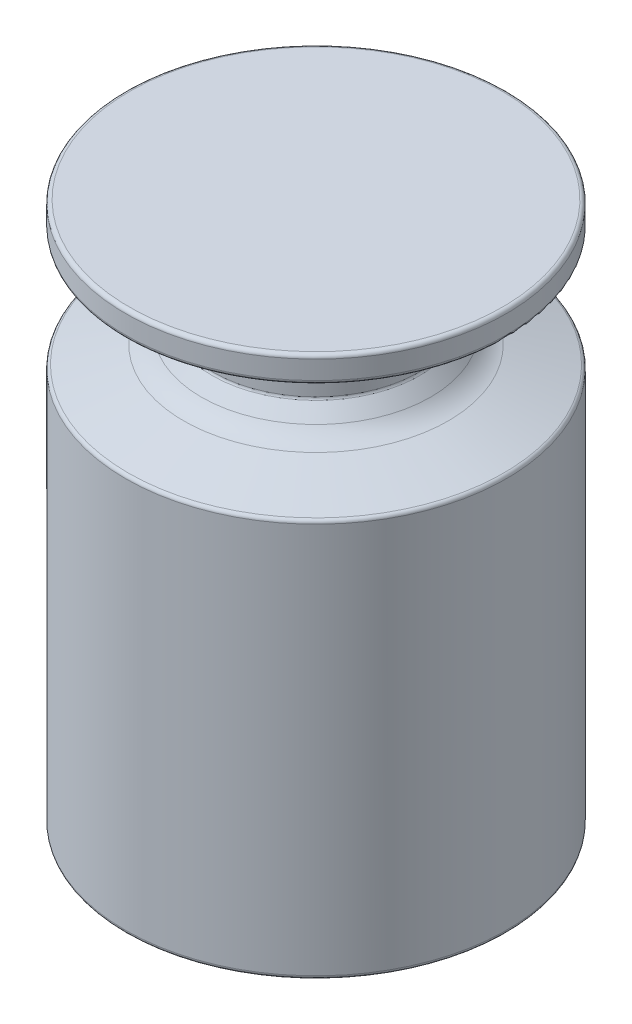
ISO-10303-21;
HEADER;
FILE_DESCRIPTION(('STEP AP214'),'2;1');
FILE_NAME('part.step','',(''),(''),'','','');
FILE_SCHEMA(('AUTOMOTIVE_DESIGN { 1 0 10303 214 1 1 1 1 }'));
ENDSEC;
DATA;
#1=APPLICATION_CONTEXT('core data for automotive mechanical design processes');
#2=APPLICATION_PROTOCOL_DEFINITION('international standard','automotive_design',2000,#1);
#3=PRODUCT_CONTEXT('',#1,'mechanical');
#4=PRODUCT('Part','Part','',(#3));
#5=PRODUCT_RELATED_PRODUCT_CATEGORY('part','',(#4));
#6=PRODUCT_DEFINITION_FORMATION('','',#4);
#7=PRODUCT_DEFINITION_CONTEXT('part definition',#1,'design');
#8=PRODUCT_DEFINITION('design','',#6,#7);
#9=PRODUCT_DEFINITION_SHAPE('','',#8);
#10=(LENGTH_UNIT() NAMED_UNIT(*) SI_UNIT(.MILLI.,.METRE.));
#11=(NAMED_UNIT(*) PLANE_ANGLE_UNIT() SI_UNIT($,.RADIAN.));
#12=(NAMED_UNIT(*) SI_UNIT($,.STERADIAN.) SOLID_ANGLE_UNIT());
#13=UNCERTAINTY_MEASURE_WITH_UNIT(LENGTH_MEASURE(1.E-05),#10,'distance_accuracy_value','');
#14=(GEOMETRIC_REPRESENTATION_CONTEXT(3) GLOBAL_UNCERTAINTY_ASSIGNED_CONTEXT((#13)) GLOBAL_UNIT_ASSIGNED_CONTEXT((#10,
#11,#12)) REPRESENTATION_CONTEXT('',''));
#15=CARTESIAN_POINT('',(0.,0.,0.));
#16=DIRECTION('',(0.,0.,1.));
#17=DIRECTION('',(1.,0.,0.));
#18=AXIS2_PLACEMENT_3D('',#15,#16,#17);
#19=CARTESIAN_POINT('',(25.,-35.55,0.));
#20=DIRECTION('',(0.,1.,0.));
#21=DIRECTION('',(0.,0.,1.));
#22=AXIS2_PLACEMENT_3D('',#19,#20,#21);
#23=PLANE('',#22);
#24=CARTESIAN_POINT('',(0.,-35.55,0.));
#25=DIRECTION('',(0.,1.,0.));
#26=DIRECTION('',(0.,0.,1.));
#27=AXIS2_PLACEMENT_3D('',#24,#25,#26);
#28=CIRCLE('',#27,24.5);
#29=CARTESIAN_POINT('',(0.,-35.55,24.5));
#30=VERTEX_POINT('',#29);
#31=EDGE_CURVE('E67',#30,#30,#28,.F.);
#32=ORIENTED_EDGE('',*,*,#31,.T.);
#33=EDGE_LOOP('',(#32));
#34=FACE_BOUND('',#33,.T.);
#35=ADVANCED_FACE('F32',(#34),#23,.F.);
#36=CARTESIAN_POINT('',(0.,67.0922710975279,0.));
#37=DIRECTION('',(0.,1.,0.));
#38=DIRECTION('',(0.,0.,1.));
#39=AXIS2_PLACEMENT_3D('',#36,#37,#38);
#40=CYLINDRICAL_SURFACE('',#39,25.);
#41=CARTESIAN_POINT('',(0.,-35.05,0.));
#42=DIRECTION('',(0.,1.,0.));
#43=DIRECTION('',(0.,0.,1.));
#44=AXIS2_PLACEMENT_3D('',#41,#42,#43);
#45=CIRCLE('',#44,25.);
#46=CARTESIAN_POINT('',(0.,-35.05,25.));
#47=VERTEX_POINT('',#46);
#48=EDGE_CURVE('E70',#47,#47,#45,.T.);
#49=ORIENTED_EDGE('',*,*,#48,.T.);
#50=EDGE_LOOP('',(#49));
#51=FACE_BOUND('',#50,.T.);
#52=CARTESIAN_POINT('',(0.,16.2833848318691,0.));
#53=DIRECTION('',(0.,-1.,0.));
#54=DIRECTION('',(0.,0.,-1.));
#55=AXIS2_PLACEMENT_3D('',#52,#53,#54);
#56=CIRCLE('',#55,25.);
#57=CARTESIAN_POINT('',(0.,16.2833848318691,-25.));
#58=VERTEX_POINT('',#57);
#59=EDGE_CURVE('E73',#58,#58,#56,.T.);
#60=ORIENTED_EDGE('',*,*,#59,.T.);
#61=EDGE_LOOP('',(#60));
#62=FACE_BOUND('',#61,.T.);
#63=ADVANCED_FACE('F110',(#51,#62),#40,.T.);
#64=CARTESIAN_POINT('',(0.,16.65,0.));
#65=DIRECTION('',(0.,-1.,0.));
#66=DIRECTION('',(0.,0.,-1.));
#67=AXIS2_PLACEMENT_3D('',#64,#65,#66);
#68=CONICAL_SURFACE('',#67,25.,1.2653637076959);
#69=CARTESIAN_POINT('',(0.,16.7602433072432,0.));
#70=DIRECTION('',(0.,1.,0.));
#71=DIRECTION('',(0.,0.,1.));
#72=AXIS2_PLACEMENT_3D('',#69,#70,#71);
#73=CIRCLE('',#72,24.6503528997521);
#74=CARTESIAN_POINT('',(0.,16.7602433072432,24.6503528997521));
#75=VERTEX_POINT('',#74);
#76=EDGE_CURVE('E64',#75,#75,#73,.T.);
#77=ORIENTED_EDGE('',*,*,#76,.T.);
#78=EDGE_LOOP('',(#77));
#79=FACE_BOUND('',#78,.T.);
#80=CARTESIAN_POINT('',(0.,19.0517586176472,0.));
#81=DIRECTION('',(0.,-1.,0.));
#82=DIRECTION('',(0.,0.,-1.));
#83=AXIS2_PLACEMENT_3D('',#80,#81,#82);
#84=CIRCLE('',#83,17.382594851739);
#85=CARTESIAN_POINT('',(0.,19.0517586176472,-17.382594851739));
#86=VERTEX_POINT('',#85);
#87=EDGE_CURVE('E76',#86,#86,#84,.T.);
#88=ORIENTED_EDGE('',*,*,#87,.T.);
#89=EDGE_LOOP('',(#88));
#90=FACE_BOUND('',#89,.T.);
#91=ADVANCED_FACE('F115',(#79,#90),#68,.T.);
#92=CARTESIAN_POINT('',(0.,19.4876890999108,0.));
#93=DIRECTION('',(0.,-1.,0.));
#94=DIRECTION('',(0.,0.,-1.));
#95=AXIS2_PLACEMENT_3D('',#92,#93,#94);
#96=CONICAL_SURFACE('',#95,16.,0.700962888192259);
#97=CARTESIAN_POINT('',(0.,22.3103101696415,0.));
#98=DIRECTION('',(0.,-1.,0.));
#99=DIRECTION('',(0.,0.,-1.));
#100=AXIS2_PLACEMENT_3D('',#97,#98,#99);
#101=CIRCLE('',#100,13.6178892383935);
#102=CARTESIAN_POINT('',(0.,22.3103101696415,-13.6178892383935));
#103=VERTEX_POINT('',#102);
#104=EDGE_CURVE('E10',#103,#103,#101,.T.);
#105=ORIENTED_EDGE('',*,*,#104,.T.);
#106=EDGE_LOOP('',(#105));
#107=FACE_BOUND('',#106,.T.);
#108=CARTESIAN_POINT('',(0.,20.5955741414353,0.));
#109=DIRECTION('',(0.,-1.,0.));
#110=DIRECTION('',(0.,0.,-1.));
#111=AXIS2_PLACEMENT_3D('',#108,#109,#110);
#112=CIRCLE('',#111,15.0650162331955);
#113=CARTESIAN_POINT('',(0.,20.5955741414353,-15.0650162331955));
#114=VERTEX_POINT('',#113);
#115=EDGE_CURVE('E79',#114,#114,#112,.F.);
#116=ORIENTED_EDGE('',*,*,#115,.T.);
#117=EDGE_LOOP('',(#116));
#118=FACE_BOUND('',#117,.T.);
#119=ADVANCED_FACE('F121',(#107,#118),#96,.T.);
#120=CARTESIAN_POINT('',(0.,67.0922710975279,0.));
#121=DIRECTION('',(0.,1.,0.));
#122=DIRECTION('',(0.,0.,1.));
#123=AXIS2_PLACEMENT_3D('',#120,#121,#122);
#124=CYLINDRICAL_SURFACE('',#123,13.5);
#125=CARTESIAN_POINT('',(0.,26.2672129073632,0.));
#126=DIRECTION('',(0.,1.,0.));
#127=DIRECTION('',(0.,0.,1.));
#128=AXIS2_PLACEMENT_3D('',#125,#126,#127);
#129=CIRCLE('',#128,13.5);
#130=CARTESIAN_POINT('',(0.,26.2672129073632,13.5));
#131=VERTEX_POINT('',#130);
#132=EDGE_CURVE('E39',#131,#131,#129,.F.);
#133=ORIENTED_EDGE('',*,*,#132,.T.);
#134=EDGE_LOOP('',(#133));
#135=FACE_BOUND('',#134,.T.);
#136=CARTESIAN_POINT('',(0.,22.6327870926368,0.));
#137=DIRECTION('',(0.,1.,0.));
#138=DIRECTION('',(0.,0.,1.));
#139=AXIS2_PLACEMENT_3D('',#136,#137,#138);
#140=CIRCLE('',#139,13.5);
#141=CARTESIAN_POINT('',(0.,22.6327870926368,13.5));
#142=VERTEX_POINT('',#141);
#143=EDGE_CURVE('E43',#142,#142,#140,.T.);
#144=ORIENTED_EDGE('',*,*,#143,.T.);
#145=EDGE_LOOP('',(#144));
#146=FACE_BOUND('',#145,.T.);
#147=ADVANCED_FACE('F125',(#135,#146),#124,.T.);
#148=CARTESIAN_POINT('',(0.,26.45,0.));
#149=DIRECTION('',(0.,1.,0.));
#150=DIRECTION('',(0.,0.,1.));
#151=AXIS2_PLACEMENT_3D('',#148,#149,#150);
#152=CONICAL_SURFACE('',#151,13.5,0.700962888192265);
#153=CARTESIAN_POINT('',(0.,26.5896898303585,0.));
#154=DIRECTION('',(0.,1.,0.));
#155=DIRECTION('',(0.,0.,1.));
#156=AXIS2_PLACEMENT_3D('',#153,#154,#155);
#157=CIRCLE('',#156,13.6178892383935);
#158=CARTESIAN_POINT('',(0.,26.5896898303585,13.6178892383935));
#159=VERTEX_POINT('',#158);
#160=EDGE_CURVE('E47',#159,#159,#157,.T.);
#161=ORIENTED_EDGE('',*,*,#160,.T.);
#162=EDGE_LOOP('',(#161));
#163=FACE_BOUND('',#162,.T.);
#164=CARTESIAN_POINT('',(0.,28.3044258585647,0.));
#165=DIRECTION('',(0.,1.,0.));
#166=DIRECTION('',(0.,0.,1.));
#167=AXIS2_PLACEMENT_3D('',#164,#165,#166);
#168=CIRCLE('',#167,15.0650162331955);
#169=CARTESIAN_POINT('',(0.,28.3044258585647,15.0650162331955));
#170=VERTEX_POINT('',#169);
#171=EDGE_CURVE('E82',#170,#170,#168,.F.);
#172=ORIENTED_EDGE('',*,*,#171,.T.);
#173=EDGE_LOOP('',(#172));
#174=FACE_BOUND('',#173,.T.);
#175=ADVANCED_FACE('F128',(#163,#174),#152,.T.);
#176=CARTESIAN_POINT('',(0.,29.4123109000892,0.));
#177=DIRECTION('',(0.,1.,0.));
#178=DIRECTION('',(0.,0.,1.));
#179=AXIS2_PLACEMENT_3D('',#176,#177,#178);
#180=CONICAL_SURFACE('',#179,16.,1.2653637076959);
#181=CARTESIAN_POINT('',(0.,32.1397566927568,0.));
#182=DIRECTION('',(0.,-1.,0.));
#183=DIRECTION('',(0.,0.,-1.));
#184=AXIS2_PLACEMENT_3D('',#181,#182,#183);
#185=CIRCLE('',#184,24.6503528997521);
#186=CARTESIAN_POINT('',(0.,32.1397566927568,-24.6503528997521));
#187=VERTEX_POINT('',#186);
#188=EDGE_CURVE('E55',#187,#187,#185,.T.);
#189=ORIENTED_EDGE('',*,*,#188,.T.);
#190=EDGE_LOOP('',(#189));
#191=FACE_BOUND('',#190,.T.);
#192=CARTESIAN_POINT('',(0.,29.8482413823528,0.));
#193=DIRECTION('',(0.,1.,0.));
#194=DIRECTION('',(0.,0.,1.));
#195=AXIS2_PLACEMENT_3D('',#192,#193,#194);
#196=CIRCLE('',#195,17.382594851739);
#197=CARTESIAN_POINT('',(0.,29.8482413823528,17.382594851739));
#198=VERTEX_POINT('',#197);
#199=EDGE_CURVE('E85',#198,#198,#196,.T.);
#200=ORIENTED_EDGE('',*,*,#199,.T.);
#201=EDGE_LOOP('',(#200));
#202=FACE_BOUND('',#201,.T.);
#203=ADVANCED_FACE('F89',(#191,#202),#180,.T.);
#204=CARTESIAN_POINT('',(0.,67.0922710975279,0.));
#205=DIRECTION('',(0.,1.,0.));
#206=DIRECTION('',(0.,0.,1.));
#207=AXIS2_PLACEMENT_3D('',#204,#205,#206);
#208=CYLINDRICAL_SURFACE('',#207,25.);
#209=CARTESIAN_POINT('',(0.,32.6166151681309,0.));
#210=DIRECTION('',(0.,-1.,0.));
#211=DIRECTION('',(0.,0.,-1.));
#212=AXIS2_PLACEMENT_3D('',#209,#210,#211);
#213=CIRCLE('',#212,25.);
#214=CARTESIAN_POINT('',(0.,32.6166151681309,-25.));
#215=VERTEX_POINT('',#214);
#216=EDGE_CURVE('E58',#215,#215,#213,.F.);
#217=ORIENTED_EDGE('',*,*,#216,.T.);
#218=EDGE_LOOP('',(#217));
#219=FACE_BOUND('',#218,.T.);
#220=CARTESIAN_POINT('',(0.,35.05,0.));
#221=DIRECTION('',(0.,-1.,0.));
#222=DIRECTION('',(0.,0.,-1.));
#223=AXIS2_PLACEMENT_3D('',#220,#221,#222);
#224=CIRCLE('',#223,25.);
#225=CARTESIAN_POINT('',(0.,35.05,-25.));
#226=VERTEX_POINT('',#225);
#227=EDGE_CURVE('E61',#226,#226,#224,.T.);
#228=ORIENTED_EDGE('',*,*,#227,.T.);
#229=EDGE_LOOP('',(#228));
#230=FACE_BOUND('',#229,.T.);
#231=ADVANCED_FACE('F104',(#219,#230),#208,.T.);
#232=CARTESIAN_POINT('',(0.,35.55,0.));
#233=DIRECTION('',(0.,-1.,0.));
#234=DIRECTION('',(0.,0.,-1.));
#235=AXIS2_PLACEMENT_3D('',#232,#233,#234);
#236=PLANE('',#235);
#237=CARTESIAN_POINT('',(0.,35.55,0.));
#238=DIRECTION('',(0.,-1.,0.));
#239=DIRECTION('',(0.,0.,-1.));
#240=AXIS2_PLACEMENT_3D('',#237,#238,#239);
#241=CIRCLE('',#240,24.5);
#242=CARTESIAN_POINT('',(0.,35.55,-24.5));
#243=VERTEX_POINT('',#242);
#244=EDGE_CURVE('E52',#243,#243,#241,.F.);
#245=ORIENTED_EDGE('',*,*,#244,.T.);
#246=EDGE_LOOP('',(#245));
#247=FACE_BOUND('',#246,.T.);
#248=ADVANCED_FACE('F94',(#247),#236,.F.);
#249=CARTESIAN_POINT('',(0.,25.0796566286117,0.));
#250=DIRECTION('',(0.,1.,0.));
#251=DIRECTION('',(0.,0.,1.));
#252=AXIS2_PLACEMENT_3D('',#249,#250,#251);
#253=TOROIDAL_SURFACE('',#252,18.8861238492603,5.);
#254=ORIENTED_EDGE('',*,*,#171,.F.);
#255=EDGE_LOOP('',(#254));
#256=FACE_BOUND('',#255,.T.);
#257=ORIENTED_EDGE('',*,*,#199,.F.);
#258=EDGE_LOOP('',(#257));
#259=FACE_BOUND('',#258,.T.);
#260=ADVANCED_FACE('F91',(#256,#259),#253,.F.);
#261=CARTESIAN_POINT('',(0.,23.8203433713883,0.));
#262=DIRECTION('',(0.,1.,0.));
#263=DIRECTION('',(0.,0.,1.));
#264=AXIS2_PLACEMENT_3D('',#261,#262,#263);
#265=TOROIDAL_SURFACE('',#264,18.8861238492603,5.);
#266=ORIENTED_EDGE('',*,*,#87,.F.);
#267=EDGE_LOOP('',(#266));
#268=FACE_BOUND('',#267,.T.);
#269=ORIENTED_EDGE('',*,*,#115,.F.);
#270=EDGE_LOOP('',(#269));
#271=FACE_BOUND('',#270,.T.);
#272=ADVANCED_FACE('F93',(#268,#271),#265,.F.);
#273=CARTESIAN_POINT('',(0.,-35.05,0.));
#274=DIRECTION('',(0.,1.,0.));
#275=DIRECTION('',(0.,0.,1.));
#276=AXIS2_PLACEMENT_3D('',#273,#274,#275);
#277=TOROIDAL_SURFACE('',#276,24.5,0.5);
#278=ORIENTED_EDGE('',*,*,#31,.F.);
#279=EDGE_LOOP('',(#278));
#280=FACE_BOUND('',#279,.T.);
#281=ORIENTED_EDGE('',*,*,#48,.F.);
#282=EDGE_LOOP('',(#281));
#283=FACE_BOUND('',#282,.T.);
#284=ADVANCED_FACE('F101',(#280,#283),#277,.T.);
#285=CARTESIAN_POINT('',(0.,16.2833848318691,0.));
#286=DIRECTION('',(0.,-1.,0.));
#287=DIRECTION('',(0.,0.,-1.));
#288=AXIS2_PLACEMENT_3D('',#285,#286,#287);
#289=TOROIDAL_SURFACE('',#288,24.5,0.5);
#290=ORIENTED_EDGE('',*,*,#59,.F.);
#291=EDGE_LOOP('',(#290));
#292=FACE_BOUND('',#291,.T.);
#293=ORIENTED_EDGE('',*,*,#76,.F.);
#294=EDGE_LOOP('',(#293));
#295=FACE_BOUND('',#294,.T.);
#296=ADVANCED_FACE('F155',(#292,#295),#289,.T.);
#297=CARTESIAN_POINT('',(0.,32.6166151681309,0.));
#298=DIRECTION('',(0.,-1.,0.));
#299=DIRECTION('',(0.,0.,-1.));
#300=AXIS2_PLACEMENT_3D('',#297,#298,#299);
#301=TOROIDAL_SURFACE('',#300,24.5,0.5);
#302=ORIENTED_EDGE('',*,*,#188,.F.);
#303=EDGE_LOOP('',(#302));
#304=FACE_BOUND('',#303,.T.);
#305=ORIENTED_EDGE('',*,*,#216,.F.);
#306=EDGE_LOOP('',(#305));
#307=FACE_BOUND('',#306,.T.);
#308=ADVANCED_FACE('F147',(#304,#307),#301,.T.);
#309=CARTESIAN_POINT('',(0.,35.05,0.));
#310=DIRECTION('',(0.,-1.,0.));
#311=DIRECTION('',(0.,0.,-1.));
#312=AXIS2_PLACEMENT_3D('',#309,#310,#311);
#313=TOROIDAL_SURFACE('',#312,24.5,0.5);
#314=ORIENTED_EDGE('',*,*,#227,.F.);
#315=EDGE_LOOP('',(#314));
#316=FACE_BOUND('',#315,.T.);
#317=ORIENTED_EDGE('',*,*,#244,.F.);
#318=EDGE_LOOP('',(#317));
#319=FACE_BOUND('',#318,.T.);
#320=ADVANCED_FACE('F143',(#316,#319),#313,.T.);
#321=CARTESIAN_POINT('',(0.,26.2672129073632,0.));
#322=DIRECTION('',(0.,1.,0.));
#323=DIRECTION('',(0.,0.,1.));
#324=AXIS2_PLACEMENT_3D('',#321,#322,#323);
#325=TOROIDAL_SURFACE('',#324,14.,0.5);
#326=ORIENTED_EDGE('',*,*,#132,.F.);
#327=EDGE_LOOP('',(#326));
#328=FACE_BOUND('',#327,.T.);
#329=ORIENTED_EDGE('',*,*,#160,.F.);
#330=EDGE_LOOP('',(#329));
#331=FACE_BOUND('',#330,.T.);
#332=ADVANCED_FACE('F146',(#328,#331),#325,.F.);
#333=CARTESIAN_POINT('',(0.,22.6327870926368,0.));
#334=DIRECTION('',(0.,1.,0.));
#335=DIRECTION('',(0.,0.,1.));
#336=AXIS2_PLACEMENT_3D('',#333,#334,#335);
#337=TOROIDAL_SURFACE('',#336,14.,0.5);
#338=ORIENTED_EDGE('',*,*,#104,.F.);
#339=EDGE_LOOP('',(#338));
#340=FACE_BOUND('',#339,.T.);
#341=ORIENTED_EDGE('',*,*,#143,.F.);
#342=EDGE_LOOP('',(#341));
#343=FACE_BOUND('',#342,.T.);
#344=ADVANCED_FACE('F34',(#340,#343),#337,.F.);
#345=CLOSED_SHELL('',(#35,#63,#91,#119,#147,#175,#203,#231,#248,#260,#272,#284,#296,#308,#320,
#332,#344));
#346=MANIFOLD_SOLID_BREP('B2',#345);
#347=ADVANCED_BREP_SHAPE_REPRESENTATION('',(#18,#346),#14);
#348=SHAPE_DEFINITION_REPRESENTATION(#9,#347);
ENDSEC;
END-ISO-10303-21;
